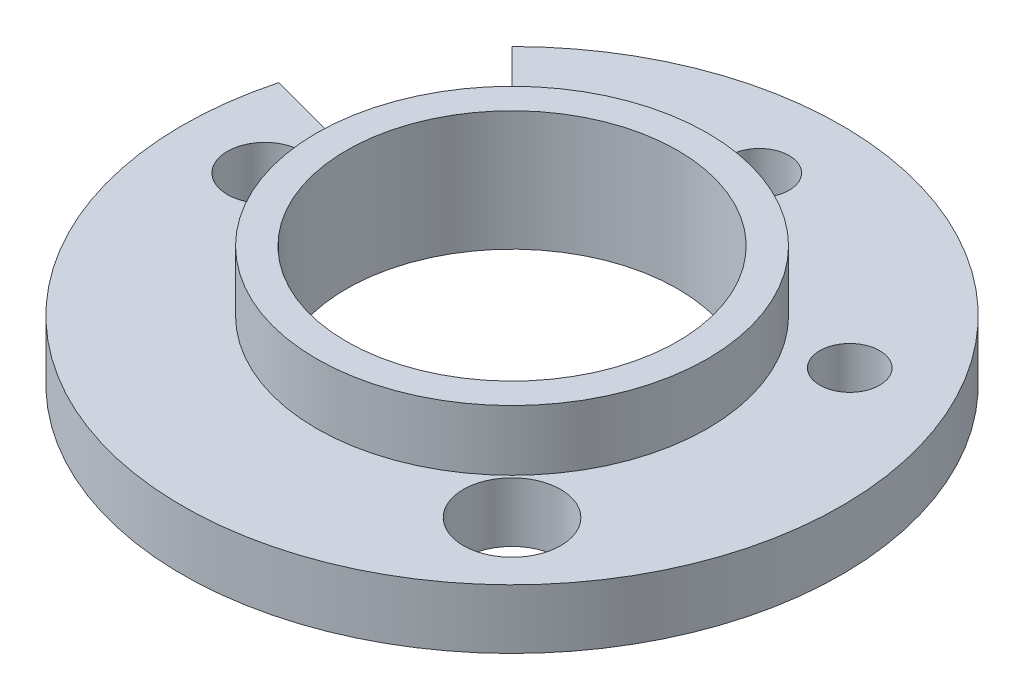
ISO-10303-21;
HEADER;
FILE_DESCRIPTION(('STEP AP214'),'2;1');
FILE_NAME('part.step','',(''),(''),'','','');
FILE_SCHEMA(('AUTOMOTIVE_DESIGN { 1 0 10303 214 1 1 1 1 }'));
ENDSEC;
DATA;
#1=APPLICATION_CONTEXT('core data for automotive mechanical design processes');
#2=APPLICATION_PROTOCOL_DEFINITION('international standard','automotive_design',2000,#1);
#3=PRODUCT_CONTEXT('',#1,'mechanical');
#4=PRODUCT('Part','Part','',(#3));
#5=PRODUCT_RELATED_PRODUCT_CATEGORY('part','',(#4));
#6=PRODUCT_DEFINITION_FORMATION('','',#4);
#7=PRODUCT_DEFINITION_CONTEXT('part definition',#1,'design');
#8=PRODUCT_DEFINITION('design','',#6,#7);
#9=PRODUCT_DEFINITION_SHAPE('','',#8);
#10=(LENGTH_UNIT() NAMED_UNIT(*) SI_UNIT(.MILLI.,.METRE.));
#11=(NAMED_UNIT(*) PLANE_ANGLE_UNIT() SI_UNIT($,.RADIAN.));
#12=(NAMED_UNIT(*) SI_UNIT($,.STERADIAN.) SOLID_ANGLE_UNIT());
#13=UNCERTAINTY_MEASURE_WITH_UNIT(LENGTH_MEASURE(1.E-05),#10,'distance_accuracy_value','');
#14=(GEOMETRIC_REPRESENTATION_CONTEXT(3) GLOBAL_UNCERTAINTY_ASSIGNED_CONTEXT((#13)) GLOBAL_UNIT_ASSIGNED_CONTEXT((#10,
#11,#12)) REPRESENTATION_CONTEXT('',''));
#15=CARTESIAN_POINT('',(0.,0.,0.));
#16=DIRECTION('',(0.,0.,1.));
#17=DIRECTION('',(1.,0.,0.));
#18=AXIS2_PLACEMENT_3D('',#15,#16,#17);
#19=CARTESIAN_POINT('',(22.,0.,0.));
#20=DIRECTION('',(0.,-1.,0.));
#21=DIRECTION('',(0.,0.,-1.));
#22=AXIS2_PLACEMENT_3D('',#19,#20,#21);
#23=PLANE('',#22);
#24=CARTESIAN_POINT('',(14.2894191624432,0.,-8.25000000000002));
#25=DIRECTION('',(0.,1.,0.));
#26=DIRECTION('',(0.,0.,1.));
#27=AXIS2_PLACEMENT_3D('',#24,#25,#26);
#28=CIRCLE('',#27,2.00000000000001);
#29=CARTESIAN_POINT('',(14.2894191624432,0.,-6.25000000000001));
#30=VERTEX_POINT('',#29);
#31=EDGE_CURVE('E132',#30,#30,#28,.T.);
#32=ORIENTED_EDGE('',*,*,#31,.T.);
#33=EDGE_LOOP('',(#32));
#34=FACE_BOUND('',#33,.T.);
#35=CARTESIAN_POINT('',(0.,0.,0.));
#36=DIRECTION('',(0.,-1.,0.));
#37=DIRECTION('',(0.,0.,1.));
#38=AXIS2_PLACEMENT_3D('',#35,#36,#37);
#39=CIRCLE('',#38,13.1091247057172);
#40=CARTESIAN_POINT('',(-12.6624421132963,0.,-3.39289113846368));
#41=VERTEX_POINT('',#40);
#42=CARTESIAN_POINT('',(-9.26955097483271,0.,-9.26955097483274));
#43=VERTEX_POINT('',#42);
#44=EDGE_CURVE('E80',#41,#43,#39,.T.);
#45=ORIENTED_EDGE('',*,*,#44,.T.);
#46=DIRECTION('',(-0.707106781186546,0.,-0.707106781186549));
#47=VECTOR('',#46,1.);
#48=CARTESIAN_POINT('',(-16.4420452068836,0.,-16.4420452068836));
#49=LINE('',#48,#47);
#50=CARTESIAN_POINT('',(-15.556349186104,0.,-15.5563491861041));
#51=VERTEX_POINT('',#50);
#52=EDGE_CURVE('E85',#43,#51,#49,.T.);
#53=ORIENTED_EDGE('',*,*,#52,.T.);
#54=CARTESIAN_POINT('',(0.,0.,0.));
#55=DIRECTION('',(0.,-1.,0.));
#56=DIRECTION('',(0.,0.,-1.));
#57=AXIS2_PLACEMENT_3D('',#54,#55,#56);
#58=CIRCLE('',#57,22.);
#59=CARTESIAN_POINT('',(-21.2503681783595,0.,-5.69401899225561));
#60=VERTEX_POINT('',#59);
#61=EDGE_CURVE('E109',#51,#60,#58,.T.);
#62=ORIENTED_EDGE('',*,*,#61,.T.);
#63=DIRECTION('',(0.965925826289066,0.,0.258819045102528));
#64=VECTOR('',#63,1.);
#65=CARTESIAN_POINT('',(-22.4602514427751,0.,-6.01820623589173));
#66=LINE('',#65,#64);
#67=EDGE_CURVE('E49',#60,#41,#66,.T.);
#68=ORIENTED_EDGE('',*,*,#67,.T.);
#69=EDGE_LOOP('',(#45,#53,#62,#68));
#70=FACE_BOUND('',#69,.T.);
#71=CARTESIAN_POINT('',(0.,0.,0.));
#72=DIRECTION('',(0.,-1.,0.));
#73=DIRECTION('',(0.,0.,-1.));
#74=AXIS2_PLACEMENT_3D('',#71,#72,#73);
#75=CIRCLE('',#74,11.05);
#76=CARTESIAN_POINT('',(0.,0.,-11.05));
#77=VERTEX_POINT('',#76);
#78=EDGE_CURVE('E123',#77,#77,#75,.T.);
#79=ORIENTED_EDGE('',*,*,#78,.F.);
#80=EDGE_LOOP('',(#79));
#81=FACE_BOUND('',#80,.T.);
#82=CARTESIAN_POINT('',(-16.5,0.,0.));
#83=DIRECTION('',(0.,1.,0.));
#84=DIRECTION('',(0.,0.,1.));
#85=AXIS2_PLACEMENT_3D('',#82,#83,#84);
#86=CIRCLE('',#85,2.5);
#87=CARTESIAN_POINT('',(-16.5,0.,2.5));
#88=VERTEX_POINT('',#87);
#89=EDGE_CURVE('E105',#88,#88,#86,.T.);
#90=ORIENTED_EDGE('',*,*,#89,.T.);
#91=EDGE_LOOP('',(#90));
#92=FACE_BOUND('',#91,.T.);
#93=CARTESIAN_POINT('',(11.667261889578,0.,11.6672618895781));
#94=DIRECTION('',(0.,1.,0.));
#95=DIRECTION('',(0.,0.,1.));
#96=AXIS2_PLACEMENT_3D('',#93,#94,#95);
#97=CIRCLE('',#96,3.25);
#98=CARTESIAN_POINT('',(11.667261889578,0.,14.9172618895781));
#99=VERTEX_POINT('',#98);
#100=EDGE_CURVE('E95',#99,#99,#97,.T.);
#101=ORIENTED_EDGE('',*,*,#100,.T.);
#102=EDGE_LOOP('',(#101));
#103=FACE_BOUND('',#102,.T.);
#104=CARTESIAN_POINT('',(0.,0.,-16.5));
#105=DIRECTION('',(0.,1.,0.));
#106=DIRECTION('',(0.,0.,1.));
#107=AXIS2_PLACEMENT_3D('',#104,#105,#106);
#108=CIRCLE('',#107,2.);
#109=CARTESIAN_POINT('',(0.,0.,-14.5));
#110=VERTEX_POINT('',#109);
#111=EDGE_CURVE('E140',#110,#110,#108,.T.);
#112=ORIENTED_EDGE('',*,*,#111,.T.);
#113=EDGE_LOOP('',(#112));
#114=FACE_BOUND('',#113,.T.);
#115=ADVANCED_FACE('F33',(#34,#70,#81,#92,#103,#114),#23,.T.);
#116=CARTESIAN_POINT('',(13.05,3.96925539191489,0.));
#117=DIRECTION('',(0.,1.,0.));
#118=DIRECTION('',(0.,0.,1.));
#119=AXIS2_PLACEMENT_3D('',#116,#117,#118);
#120=PLANE('',#119);
#121=CARTESIAN_POINT('',(14.2894191624432,3.96925539191489,-8.25000000000002));
#122=DIRECTION('',(0.,1.,0.));
#123=DIRECTION('',(0.,0.,1.));
#124=AXIS2_PLACEMENT_3D('',#121,#122,#123);
#125=CIRCLE('',#124,2.00000000000001);
#126=CARTESIAN_POINT('',(14.2894191624432,3.96925539191489,-6.25000000000001));
#127=VERTEX_POINT('',#126);
#128=EDGE_CURVE('E130',#127,#127,#125,.F.);
#129=ORIENTED_EDGE('',*,*,#128,.T.);
#130=EDGE_LOOP('',(#129));
#131=FACE_BOUND('',#130,.T.);
#132=CARTESIAN_POINT('',(0.,3.96925539191489,0.));
#133=DIRECTION('',(0.,-1.,0.));
#134=DIRECTION('',(0.,0.,-1.));
#135=AXIS2_PLACEMENT_3D('',#132,#133,#134);
#136=CIRCLE('',#135,22.);
#137=CARTESIAN_POINT('',(-15.556349186104,3.96925539191489,-15.5563491861041));
#138=VERTEX_POINT('',#137);
#139=CARTESIAN_POINT('',(-21.2503681783595,3.96925539191489,-5.69401899225561));
#140=VERTEX_POINT('',#139);
#141=EDGE_CURVE('E111',#138,#140,#136,.T.);
#142=ORIENTED_EDGE('',*,*,#141,.F.);
#143=DIRECTION('',(0.707106781186546,0.,0.707106781186549));
#144=VECTOR('',#143,1.);
#145=CARTESIAN_POINT('',(6.52499999999998,3.96925539191489,6.525));
#146=LINE('',#145,#144);
#147=CARTESIAN_POINT('',(-9.26955097483271,3.96925539191489,-9.26955097483274));
#148=VERTEX_POINT('',#147);
#149=EDGE_CURVE('E57',#138,#148,#146,.T.);
#150=ORIENTED_EDGE('',*,*,#149,.T.);
#151=CARTESIAN_POINT('',(0.,3.96925539191489,0.));
#152=DIRECTION('',(0.,1.,0.));
#153=DIRECTION('',(0.,0.,1.));
#154=AXIS2_PLACEMENT_3D('',#151,#152,#153);
#155=CIRCLE('',#154,13.1091247057172);
#156=CARTESIAN_POINT('',(-12.6624421132963,3.96925539191489,-3.39289113846368));
#157=VERTEX_POINT('',#156);
#158=EDGE_CURVE('E11',#148,#157,#155,.T.);
#159=ORIENTED_EDGE('',*,*,#158,.T.);
#160=DIRECTION('',(-0.965925826289067,0.,-0.258819045102528));
#161=VECTOR('',#160,1.);
#162=CARTESIAN_POINT('',(12.1758157596934,3.96925539191489,3.26250000000008));
#163=LINE('',#162,#161);
#164=EDGE_CURVE('E81',#157,#140,#163,.T.);
#165=ORIENTED_EDGE('',*,*,#164,.T.);
#166=EDGE_LOOP('',(#142,#150,#159,#165));
#167=FACE_BOUND('',#166,.T.);
#168=CARTESIAN_POINT('',(0.,3.96925539191489,0.));
#169=DIRECTION('',(0.,-1.,0.));
#170=DIRECTION('',(0.,0.,-1.));
#171=AXIS2_PLACEMENT_3D('',#168,#169,#170);
#172=CIRCLE('',#171,13.05);
#173=CARTESIAN_POINT('',(0.,3.96925539191489,-13.05));
#174=VERTEX_POINT('',#173);
#175=EDGE_CURVE('E114',#174,#174,#172,.T.);
#176=ORIENTED_EDGE('',*,*,#175,.T.);
#177=EDGE_LOOP('',(#176));
#178=FACE_BOUND('',#177,.T.);
#179=CARTESIAN_POINT('',(-16.5,3.96925539191489,0.));
#180=DIRECTION('',(0.,1.,0.));
#181=DIRECTION('',(0.,0.,1.));
#182=AXIS2_PLACEMENT_3D('',#179,#180,#181);
#183=CIRCLE('',#182,2.5);
#184=CARTESIAN_POINT('',(-16.5,3.96925539191489,2.5));
#185=VERTEX_POINT('',#184);
#186=EDGE_CURVE('E108',#185,#185,#183,.F.);
#187=ORIENTED_EDGE('',*,*,#186,.T.);
#188=EDGE_LOOP('',(#187));
#189=FACE_BOUND('',#188,.T.);
#190=CARTESIAN_POINT('',(11.667261889578,3.96925539191489,11.6672618895781));
#191=DIRECTION('',(0.,1.,0.));
#192=DIRECTION('',(0.,0.,1.));
#193=AXIS2_PLACEMENT_3D('',#190,#191,#192);
#194=CIRCLE('',#193,3.25);
#195=CARTESIAN_POINT('',(11.667261889578,3.96925539191489,14.9172618895781));
#196=VERTEX_POINT('',#195);
#197=EDGE_CURVE('E92',#196,#196,#194,.F.);
#198=ORIENTED_EDGE('',*,*,#197,.T.);
#199=EDGE_LOOP('',(#198));
#200=FACE_BOUND('',#199,.T.);
#201=CARTESIAN_POINT('',(0.,3.96925539191489,-16.5));
#202=DIRECTION('',(0.,1.,0.));
#203=DIRECTION('',(0.,0.,1.));
#204=AXIS2_PLACEMENT_3D('',#201,#202,#203);
#205=CIRCLE('',#204,2.);
#206=CARTESIAN_POINT('',(0.,3.96925539191489,-14.5));
#207=VERTEX_POINT('',#206);
#208=EDGE_CURVE('E36',#207,#207,#205,.F.);
#209=ORIENTED_EDGE('',*,*,#208,.T.);
#210=EDGE_LOOP('',(#209));
#211=FACE_BOUND('',#210,.T.);
#212=ADVANCED_FACE('F159',(#131,#167,#178,#189,#200,#211),#120,.T.);
#213=CARTESIAN_POINT('',(0.,0.,0.));
#214=DIRECTION('',(0.,-1.,0.));
#215=DIRECTION('',(0.,0.,-1.));
#216=AXIS2_PLACEMENT_3D('',#213,#214,#215);
#217=CYLINDRICAL_SURFACE('',#216,22.);
#218=ORIENTED_EDGE('',*,*,#61,.F.);
#219=DIRECTION('',(0.,-1.,0.));
#220=VECTOR('',#219,1.);
#221=CARTESIAN_POINT('',(-15.556349186104,0.,-15.5563491861041));
#222=LINE('',#221,#220);
#223=EDGE_CURVE('E41',#51,#138,#222,.F.);
#224=ORIENTED_EDGE('',*,*,#223,.T.);
#225=ORIENTED_EDGE('',*,*,#141,.T.);
#226=DIRECTION('',(0.,-1.,0.));
#227=VECTOR('',#226,1.);
#228=CARTESIAN_POINT('',(-21.2503681783595,0.,-5.69401899225561));
#229=LINE('',#228,#227);
#230=EDGE_CURVE('E126',#140,#60,#229,.T.);
#231=ORIENTED_EDGE('',*,*,#230,.T.);
#232=EDGE_LOOP('',(#218,#224,#225,#231));
#233=FACE_BOUND('',#232,.T.);
#234=ADVANCED_FACE('F163',(#233),#217,.T.);
#235=CARTESIAN_POINT('',(0.,0.,0.));
#236=DIRECTION('',(0.,-1.,0.));
#237=DIRECTION('',(0.,0.,-1.));
#238=AXIS2_PLACEMENT_3D('',#235,#236,#237);
#239=CYLINDRICAL_SURFACE('',#238,11.05);
#240=ORIENTED_EDGE('',*,*,#78,.T.);
#241=EDGE_LOOP('',(#240));
#242=FACE_BOUND('',#241,.T.);
#243=CARTESIAN_POINT('',(0.,8.,0.));
#244=DIRECTION('',(0.,-1.,0.));
#245=DIRECTION('',(0.,0.,-1.));
#246=AXIS2_PLACEMENT_3D('',#243,#244,#245);
#247=CIRCLE('',#246,11.05);
#248=CARTESIAN_POINT('',(0.,8.,-11.05));
#249=VERTEX_POINT('',#248);
#250=EDGE_CURVE('E120',#249,#249,#247,.T.);
#251=ORIENTED_EDGE('',*,*,#250,.F.);
#252=EDGE_LOOP('',(#251));
#253=FACE_BOUND('',#252,.T.);
#254=ADVANCED_FACE('F168',(#242,#253),#239,.F.);
#255=CARTESIAN_POINT('',(11.05,8.,0.));
#256=DIRECTION('',(0.,1.,0.));
#257=DIRECTION('',(0.,0.,1.));
#258=AXIS2_PLACEMENT_3D('',#255,#256,#257);
#259=PLANE('',#258);
#260=ORIENTED_EDGE('',*,*,#250,.T.);
#261=EDGE_LOOP('',(#260));
#262=FACE_BOUND('',#261,.T.);
#263=CARTESIAN_POINT('',(0.,8.,0.));
#264=DIRECTION('',(0.,-1.,0.));
#265=DIRECTION('',(0.,0.,-1.));
#266=AXIS2_PLACEMENT_3D('',#263,#264,#265);
#267=CIRCLE('',#266,13.05);
#268=CARTESIAN_POINT('',(0.,8.,-13.05));
#269=VERTEX_POINT('',#268);
#270=EDGE_CURVE('E117',#269,#269,#267,.T.);
#271=ORIENTED_EDGE('',*,*,#270,.F.);
#272=EDGE_LOOP('',(#271));
#273=FACE_BOUND('',#272,.T.);
#274=ADVANCED_FACE('F178',(#262,#273),#259,.T.);
#275=CARTESIAN_POINT('',(0.,0.,0.));
#276=DIRECTION('',(0.,-1.,0.));
#277=DIRECTION('',(0.,0.,-1.));
#278=AXIS2_PLACEMENT_3D('',#275,#276,#277);
#279=CYLINDRICAL_SURFACE('',#278,13.05);
#280=ORIENTED_EDGE('',*,*,#270,.T.);
#281=EDGE_LOOP('',(#280));
#282=FACE_BOUND('',#281,.T.);
#283=ORIENTED_EDGE('',*,*,#175,.F.);
#284=EDGE_LOOP('',(#283));
#285=FACE_BOUND('',#284,.T.);
#286=ADVANCED_FACE('F174',(#282,#285),#279,.T.);
#287=CARTESIAN_POINT('',(-16.5,10.,0.));
#288=DIRECTION('',(0.,-1.,0.));
#289=DIRECTION('',(0.,0.,-1.));
#290=AXIS2_PLACEMENT_3D('',#287,#288,#289);
#291=CYLINDRICAL_SURFACE('',#290,2.5);
#292=ORIENTED_EDGE('',*,*,#186,.F.);
#293=EDGE_LOOP('',(#292));
#294=FACE_BOUND('',#293,.T.);
#295=ORIENTED_EDGE('',*,*,#89,.F.);
#296=EDGE_LOOP('',(#295));
#297=FACE_BOUND('',#296,.T.);
#298=ADVANCED_FACE('F177',(#294,#297),#291,.F.);
#299=CARTESIAN_POINT('',(0.,10.,0.));
#300=DIRECTION('',(0.,-1.,0.));
#301=DIRECTION('',(0.,0.,-1.));
#302=AXIS2_PLACEMENT_3D('',#299,#300,#301);
#303=CYLINDRICAL_SURFACE('',#302,13.1091247057172);
#304=DIRECTION('',(0.,-1.,0.));
#305=VECTOR('',#304,1.);
#306=CARTESIAN_POINT('',(-9.26955097483271,10.,-9.26955097483274));
#307=LINE('',#306,#305);
#308=EDGE_CURVE('E75',#148,#43,#307,.T.);
#309=ORIENTED_EDGE('',*,*,#308,.T.);
#310=ORIENTED_EDGE('',*,*,#44,.F.);
#311=DIRECTION('',(0.,-1.,0.));
#312=VECTOR('',#311,1.);
#313=CARTESIAN_POINT('',(-12.6624421132963,10.,-3.39289113846368));
#314=LINE('',#313,#312);
#315=EDGE_CURVE('E82',#157,#41,#314,.T.);
#316=ORIENTED_EDGE('',*,*,#315,.F.);
#317=ORIENTED_EDGE('',*,*,#158,.F.);
#318=EDGE_LOOP('',(#309,#310,#316,#317));
#319=FACE_BOUND('',#318,.T.);
#320=ADVANCED_FACE('F77',(#319),#303,.T.);
#321=CARTESIAN_POINT('',(-16.4420452068836,10.,-16.4420452068836));
#322=DIRECTION('',(-0.707106781186549,0.,0.707106781186546));
#323=DIRECTION('',(0.707106781186546,0.,0.707106781186549));
#324=AXIS2_PLACEMENT_3D('',#321,#322,#323);
#325=PLANE('',#324);
#326=ORIENTED_EDGE('',*,*,#223,.F.);
#327=ORIENTED_EDGE('',*,*,#52,.F.);
#328=ORIENTED_EDGE('',*,*,#308,.F.);
#329=ORIENTED_EDGE('',*,*,#149,.F.);
#330=EDGE_LOOP('',(#326,#327,#328,#329));
#331=FACE_BOUND('',#330,.T.);
#332=ADVANCED_FACE('F86',(#331),#325,.T.);
#333=CARTESIAN_POINT('',(-22.4602514427751,10.,-6.01820623589173));
#334=DIRECTION('',(0.258819045102528,0.,-0.965925826289066));
#335=DIRECTION('',(-0.965925826289067,0.,-0.258819045102528));
#336=AXIS2_PLACEMENT_3D('',#333,#334,#335);
#337=PLANE('',#336);
#338=ORIENTED_EDGE('',*,*,#315,.T.);
#339=ORIENTED_EDGE('',*,*,#67,.F.);
#340=ORIENTED_EDGE('',*,*,#230,.F.);
#341=ORIENTED_EDGE('',*,*,#164,.F.);
#342=EDGE_LOOP('',(#338,#339,#340,#341));
#343=FACE_BOUND('',#342,.T.);
#344=ADVANCED_FACE('F202',(#343),#337,.T.);
#345=CARTESIAN_POINT('',(11.667261889578,10.,11.6672618895781));
#346=DIRECTION('',(0.,-1.,0.));
#347=DIRECTION('',(0.,0.,-1.));
#348=AXIS2_PLACEMENT_3D('',#345,#346,#347);
#349=CYLINDRICAL_SURFACE('',#348,3.25);
#350=ORIENTED_EDGE('',*,*,#197,.F.);
#351=EDGE_LOOP('',(#350));
#352=FACE_BOUND('',#351,.T.);
#353=ORIENTED_EDGE('',*,*,#100,.F.);
#354=EDGE_LOOP('',(#353));
#355=FACE_BOUND('',#354,.T.);
#356=ADVANCED_FACE('F154',(#352,#355),#349,.F.);
#357=CARTESIAN_POINT('',(14.2894191624432,10.,-8.25000000000002));
#358=DIRECTION('',(0.,-1.,0.));
#359=DIRECTION('',(0.,0.,-1.));
#360=AXIS2_PLACEMENT_3D('',#357,#358,#359);
#361=CYLINDRICAL_SURFACE('',#360,2.00000000000001);
#362=ORIENTED_EDGE('',*,*,#128,.F.);
#363=EDGE_LOOP('',(#362));
#364=FACE_BOUND('',#363,.T.);
#365=ORIENTED_EDGE('',*,*,#31,.F.);
#366=EDGE_LOOP('',(#365));
#367=FACE_BOUND('',#366,.T.);
#368=ADVANCED_FACE('F148',(#364,#367),#361,.F.);
#369=CARTESIAN_POINT('',(0.,10.,-16.5));
#370=DIRECTION('',(0.,-1.,0.));
#371=DIRECTION('',(0.,0.,-1.));
#372=AXIS2_PLACEMENT_3D('',#369,#370,#371);
#373=CYLINDRICAL_SURFACE('',#372,2.);
#374=ORIENTED_EDGE('',*,*,#208,.F.);
#375=EDGE_LOOP('',(#374));
#376=FACE_BOUND('',#375,.T.);
#377=ORIENTED_EDGE('',*,*,#111,.F.);
#378=EDGE_LOOP('',(#377));
#379=FACE_BOUND('',#378,.T.);
#380=ADVANCED_FACE('F146',(#376,#379),#373,.F.);
#381=CLOSED_SHELL('',(#115,#212,#234,#254,#274,#286,#298,#320,#332,#344,#356,#368,#380));
#382=MANIFOLD_SOLID_BREP('B2',#381);
#383=ADVANCED_BREP_SHAPE_REPRESENTATION('',(#18,#382),#14);
#384=SHAPE_DEFINITION_REPRESENTATION(#9,#383);
ENDSEC;
END-ISO-10303-21;
